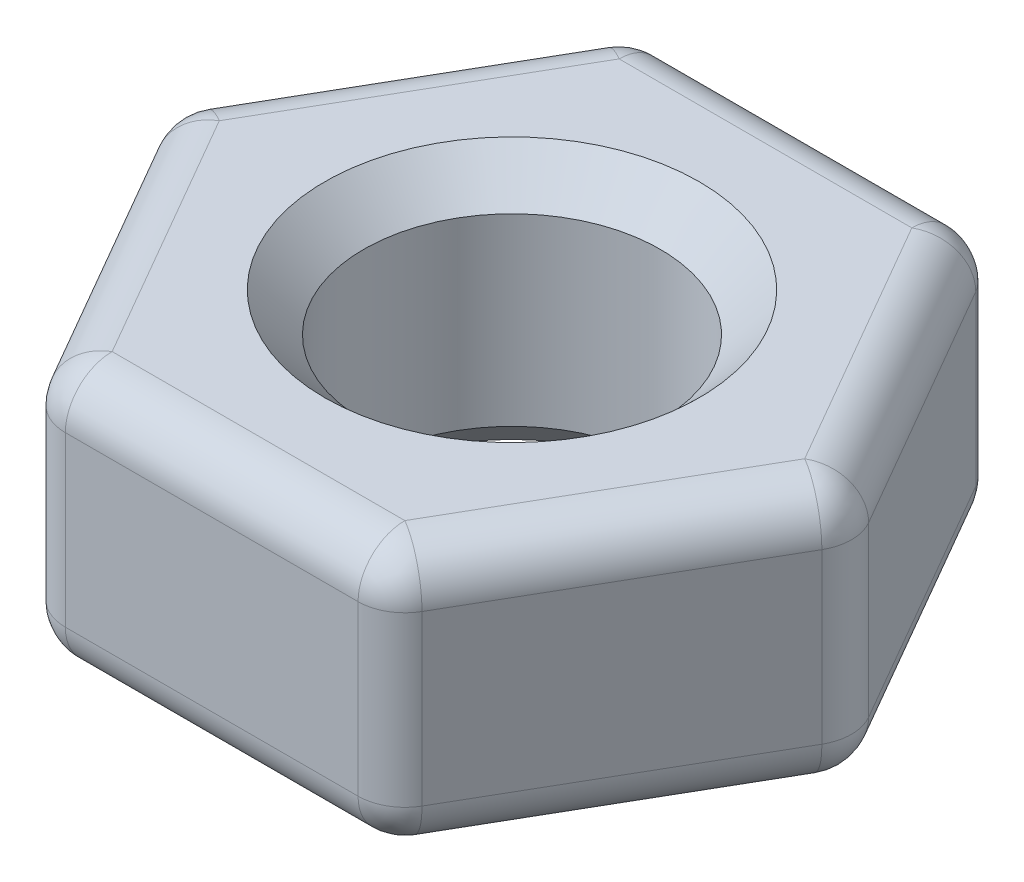
ISO-10303-21;
HEADER;
FILE_DESCRIPTION(('STEP AP214'),'2;1');
FILE_NAME('part.step','',(''),(''),'','','');
FILE_SCHEMA(('AUTOMOTIVE_DESIGN { 1 0 10303 214 1 1 1 1 }'));
ENDSEC;
DATA;
#1=APPLICATION_CONTEXT('core data for automotive mechanical design processes');
#2=APPLICATION_PROTOCOL_DEFINITION('international standard','automotive_design',2000,#1);
#3=PRODUCT_CONTEXT('',#1,'mechanical');
#4=PRODUCT('Part','Part','',(#3));
#5=PRODUCT_RELATED_PRODUCT_CATEGORY('part','',(#4));
#6=PRODUCT_DEFINITION_FORMATION('','',#4);
#7=PRODUCT_DEFINITION_CONTEXT('part definition',#1,'design');
#8=PRODUCT_DEFINITION('design','',#6,#7);
#9=PRODUCT_DEFINITION_SHAPE('','',#8);
#10=(LENGTH_UNIT() NAMED_UNIT(*) SI_UNIT(.MILLI.,.METRE.));
#11=(NAMED_UNIT(*) PLANE_ANGLE_UNIT() SI_UNIT($,.RADIAN.));
#12=(NAMED_UNIT(*) SI_UNIT($,.STERADIAN.) SOLID_ANGLE_UNIT());
#13=UNCERTAINTY_MEASURE_WITH_UNIT(LENGTH_MEASURE(1.E-05),#10,'distance_accuracy_value','');
#14=(GEOMETRIC_REPRESENTATION_CONTEXT(3) GLOBAL_UNCERTAINTY_ASSIGNED_CONTEXT((#13)) GLOBAL_UNIT_ASSIGNED_CONTEXT((#10,
#11,#12)) REPRESENTATION_CONTEXT('',''));
#15=CARTESIAN_POINT('',(0.,0.,0.));
#16=DIRECTION('',(0.,0.,1.));
#17=DIRECTION('',(1.,0.,0.));
#18=AXIS2_PLACEMENT_3D('',#15,#16,#17);
#19=CARTESIAN_POINT('',(0.,1.68,1.925));
#20=DIRECTION('',(0.,0.,-1.));
#21=DIRECTION('',(-1.,0.,0.));
#22=AXIS2_PLACEMENT_3D('',#19,#20,#21);
#23=PLANE('',#22);
#24=DIRECTION('',(1.,0.,0.));
#25=VECTOR('',#24,1.);
#26=CARTESIAN_POINT('',(-1.11139926819003,1.38,1.925));
#27=LINE('',#26,#25);
#28=CARTESIAN_POINT('',(0.938194187433143,1.38,1.925));
#29=VERTEX_POINT('',#28);
#30=CARTESIAN_POINT('',(-0.938194187433142,1.38,1.925));
#31=VERTEX_POINT('',#30);
#32=EDGE_CURVE('E177',#29,#31,#27,.F.);
#33=ORIENTED_EDGE('',*,*,#32,.T.);
#34=DIRECTION('',(0.,-1.,0.));
#35=VECTOR('',#34,1.);
#36=CARTESIAN_POINT('',(-0.938194187433142,1.68,1.925));
#37=LINE('',#36,#35);
#38=CARTESIAN_POINT('',(-0.938194187433142,0.3,1.925));
#39=VERTEX_POINT('',#38);
#40=EDGE_CURVE('E263',#31,#39,#37,.T.);
#41=ORIENTED_EDGE('',*,*,#40,.T.);
#42=DIRECTION('',(1.,0.,0.));
#43=VECTOR('',#42,1.);
#44=CARTESIAN_POINT('',(0.,0.3,1.925));
#45=LINE('',#44,#43);
#46=CARTESIAN_POINT('',(0.938194187433143,0.3,1.925));
#47=VERTEX_POINT('',#46);
#48=EDGE_CURVE('E260',#39,#47,#45,.T.);
#49=ORIENTED_EDGE('',*,*,#48,.T.);
#50=DIRECTION('',(0.,-1.,0.));
#51=VECTOR('',#50,1.);
#52=CARTESIAN_POINT('',(0.938194187433143,1.68,1.925));
#53=LINE('',#52,#51);
#54=EDGE_CURVE('E258',#47,#29,#53,.F.);
#55=ORIENTED_EDGE('',*,*,#54,.T.);
#56=EDGE_LOOP('',(#33,#41,#49,#55));
#57=FACE_BOUND('',#56,.T.);
#58=ADVANCED_FACE('F35',(#57),#23,.F.);
#59=CARTESIAN_POINT('',(1.66709890228504,1.68,0.9625));
#60=DIRECTION('',(-0.866025403784439,0.,-0.5));
#61=DIRECTION('',(-0.5,0.,0.866025403784439));
#62=AXIS2_PLACEMENT_3D('',#59,#60,#61);
#63=PLANE('',#62);
#64=DIRECTION('',(0.5,0.,-0.866025403784439));
#65=VECTOR('',#64,1.);
#66=CARTESIAN_POINT('',(1.11139926819003,1.38,1.925));
#67=LINE('',#66,#65);
#68=CARTESIAN_POINT('',(2.13619599600162,1.38,0.150000000000001));
#69=VERTEX_POINT('',#68);
#70=CARTESIAN_POINT('',(1.19800180856847,1.38,1.775));
#71=VERTEX_POINT('',#70);
#72=EDGE_CURVE('E44',#69,#71,#67,.F.);
#73=ORIENTED_EDGE('',*,*,#72,.T.);
#74=DIRECTION('',(0.,-1.,0.));
#75=VECTOR('',#74,1.);
#76=CARTESIAN_POINT('',(1.19800180856847,1.68,1.775));
#77=LINE('',#76,#75);
#78=CARTESIAN_POINT('',(1.19800180856847,0.3,1.775));
#79=VERTEX_POINT('',#78);
#80=EDGE_CURVE('E11',#71,#79,#77,.T.);
#81=ORIENTED_EDGE('',*,*,#80,.T.);
#82=DIRECTION('',(0.5,0.,-0.866025403784439));
#83=VECTOR('',#82,1.);
#84=CARTESIAN_POINT('',(1.66709890228504,0.3,0.9625));
#85=LINE('',#84,#83);
#86=CARTESIAN_POINT('',(2.13619599600162,0.3,0.150000000000001));
#87=VERTEX_POINT('',#86);
#88=EDGE_CURVE('E266',#79,#87,#85,.T.);
#89=ORIENTED_EDGE('',*,*,#88,.T.);
#90=DIRECTION('',(0.,-1.,0.));
#91=VECTOR('',#90,1.);
#92=CARTESIAN_POINT('',(2.13619599600162,1.68,0.150000000000001));
#93=LINE('',#92,#91);
#94=EDGE_CURVE('E55',#87,#69,#93,.F.);
#95=ORIENTED_EDGE('',*,*,#94,.T.);
#96=EDGE_LOOP('',(#73,#81,#89,#95));
#97=FACE_BOUND('',#96,.T.);
#98=ADVANCED_FACE('F398',(#97),#63,.F.);
#99=CARTESIAN_POINT('',(1.66709890228504,1.68,-0.9625));
#100=DIRECTION('',(-0.866025403784439,0.,0.5));
#101=DIRECTION('',(0.5,0.,0.866025403784439));
#102=AXIS2_PLACEMENT_3D('',#99,#100,#101);
#103=PLANE('',#102);
#104=DIRECTION('',(-0.5,0.,-0.866025403784439));
#105=VECTOR('',#104,1.);
#106=CARTESIAN_POINT('',(1.66709890228504,0.3,-0.9625));
#107=LINE('',#106,#105);
#108=CARTESIAN_POINT('',(2.13619599600162,0.3,-0.149999999999999));
#109=VERTEX_POINT('',#108);
#110=CARTESIAN_POINT('',(1.19800180856847,0.3,-1.775));
#111=VERTEX_POINT('',#110);
#112=EDGE_CURVE('E211',#109,#111,#107,.T.);
#113=ORIENTED_EDGE('',*,*,#112,.T.);
#114=DIRECTION('',(0.,-1.,0.));
#115=VECTOR('',#114,1.);
#116=CARTESIAN_POINT('',(1.19800180856847,1.68,-1.775));
#117=LINE('',#116,#115);
#118=CARTESIAN_POINT('',(1.19800180856847,1.38,-1.775));
#119=VERTEX_POINT('',#118);
#120=EDGE_CURVE('E216',#111,#119,#117,.F.);
#121=ORIENTED_EDGE('',*,*,#120,.T.);
#122=DIRECTION('',(-0.5,0.,-0.866025403784439));
#123=VECTOR('',#122,1.);
#124=CARTESIAN_POINT('',(2.22279853638006,1.38,0.));
#125=LINE('',#124,#123);
#126=CARTESIAN_POINT('',(2.13619599600162,1.38,-0.149999999999999));
#127=VERTEX_POINT('',#126);
#128=EDGE_CURVE('E213',#119,#127,#125,.F.);
#129=ORIENTED_EDGE('',*,*,#128,.T.);
#130=DIRECTION('',(0.,-1.,0.));
#131=VECTOR('',#130,1.);
#132=CARTESIAN_POINT('',(2.13619599600162,1.68,-0.149999999999999));
#133=LINE('',#132,#131);
#134=EDGE_CURVE('E209',#127,#109,#133,.T.);
#135=ORIENTED_EDGE('',*,*,#134,.T.);
#136=EDGE_LOOP('',(#113,#121,#129,#135));
#137=FACE_BOUND('',#136,.T.);
#138=ADVANCED_FACE('F403',(#137),#103,.F.);
#139=CARTESIAN_POINT('',(0.,1.68,-1.925));
#140=DIRECTION('',(0.,0.,1.));
#141=DIRECTION('',(1.,0.,0.));
#142=AXIS2_PLACEMENT_3D('',#139,#140,#141);
#143=PLANE('',#142);
#144=DIRECTION('',(-1.,0.,0.));
#145=VECTOR('',#144,1.);
#146=CARTESIAN_POINT('',(1.11139926819003,1.38,-1.925));
#147=LINE('',#146,#145);
#148=CARTESIAN_POINT('',(-0.938194187433142,1.38,-1.925));
#149=VERTEX_POINT('',#148);
#150=CARTESIAN_POINT('',(0.938194187433141,1.38,-1.925));
#151=VERTEX_POINT('',#150);
#152=EDGE_CURVE('E235',#149,#151,#147,.F.);
#153=ORIENTED_EDGE('',*,*,#152,.T.);
#154=DIRECTION('',(0.,-1.,0.));
#155=VECTOR('',#154,1.);
#156=CARTESIAN_POINT('',(0.938194187433141,1.68,-1.925));
#157=LINE('',#156,#155);
#158=CARTESIAN_POINT('',(0.938194187433141,0.3,-1.925));
#159=VERTEX_POINT('',#158);
#160=EDGE_CURVE('E237',#151,#159,#157,.T.);
#161=ORIENTED_EDGE('',*,*,#160,.T.);
#162=DIRECTION('',(-1.,0.,0.));
#163=VECTOR('',#162,1.);
#164=CARTESIAN_POINT('',(0.,0.3,-1.925));
#165=LINE('',#164,#163);
#166=CARTESIAN_POINT('',(-0.938194187433142,0.3,-1.925));
#167=VERTEX_POINT('',#166);
#168=EDGE_CURVE('E233',#159,#167,#165,.T.);
#169=ORIENTED_EDGE('',*,*,#168,.T.);
#170=DIRECTION('',(0.,-1.,0.));
#171=VECTOR('',#170,1.);
#172=CARTESIAN_POINT('',(-0.938194187433142,1.68,-1.925));
#173=LINE('',#172,#171);
#174=EDGE_CURVE('E231',#167,#149,#173,.F.);
#175=ORIENTED_EDGE('',*,*,#174,.T.);
#176=EDGE_LOOP('',(#153,#161,#169,#175));
#177=FACE_BOUND('',#176,.T.);
#178=ADVANCED_FACE('F393',(#177),#143,.F.);
#179=CARTESIAN_POINT('',(-1.66709890228504,1.68,-0.9625));
#180=DIRECTION('',(0.866025403784439,0.,0.5));
#181=DIRECTION('',(0.5,0.,-0.866025403784439));
#182=AXIS2_PLACEMENT_3D('',#179,#180,#181);
#183=PLANE('',#182);
#184=DIRECTION('',(-0.5,0.,0.866025403784439));
#185=VECTOR('',#184,1.);
#186=CARTESIAN_POINT('',(-1.11139926819003,1.38,-1.925));
#187=LINE('',#186,#185);
#188=CARTESIAN_POINT('',(-2.13619599600162,1.38,-0.15));
#189=VERTEX_POINT('',#188);
#190=CARTESIAN_POINT('',(-1.19800180856847,1.38,-1.775));
#191=VERTEX_POINT('',#190);
#192=EDGE_CURVE('E244',#189,#191,#187,.F.);
#193=ORIENTED_EDGE('',*,*,#192,.T.);
#194=DIRECTION('',(0.,-1.,0.));
#195=VECTOR('',#194,1.);
#196=CARTESIAN_POINT('',(-1.19800180856847,1.68,-1.775));
#197=LINE('',#196,#195);
#198=CARTESIAN_POINT('',(-1.19800180856847,0.3,-1.775));
#199=VERTEX_POINT('',#198);
#200=EDGE_CURVE('E246',#191,#199,#197,.T.);
#201=ORIENTED_EDGE('',*,*,#200,.T.);
#202=DIRECTION('',(-0.5,0.,0.866025403784439));
#203=VECTOR('',#202,1.);
#204=CARTESIAN_POINT('',(-1.66709890228504,0.3,-0.9625));
#205=LINE('',#204,#203);
#206=CARTESIAN_POINT('',(-2.13619599600162,0.3,-0.15));
#207=VERTEX_POINT('',#206);
#208=EDGE_CURVE('E242',#199,#207,#205,.T.);
#209=ORIENTED_EDGE('',*,*,#208,.T.);
#210=DIRECTION('',(0.,-1.,0.));
#211=VECTOR('',#210,1.);
#212=CARTESIAN_POINT('',(-2.13619599600162,1.68,-0.15));
#213=LINE('',#212,#211);
#214=EDGE_CURVE('E240',#207,#189,#213,.F.);
#215=ORIENTED_EDGE('',*,*,#214,.T.);
#216=EDGE_LOOP('',(#193,#201,#209,#215));
#217=FACE_BOUND('',#216,.T.);
#218=ADVANCED_FACE('F385',(#217),#183,.F.);
#219=CARTESIAN_POINT('',(0.,1.68,0.));
#220=DIRECTION('',(0.,-1.,0.));
#221=DIRECTION('',(0.,0.,-1.));
#222=AXIS2_PLACEMENT_3D('',#219,#220,#221);
#223=CYLINDRICAL_SURFACE('',#222,0.95);
#224=CARTESIAN_POINT('',(0.,1.43,0.));
#225=DIRECTION('',(0.,1.,0.));
#226=DIRECTION('',(0.,0.,1.));
#227=AXIS2_PLACEMENT_3D('',#224,#225,#226);
#228=CIRCLE('',#227,0.95);
#229=CARTESIAN_POINT('',(0.,1.43,0.95));
#230=VERTEX_POINT('',#229);
#231=EDGE_CURVE('E365',#230,#230,#228,.T.);
#232=ORIENTED_EDGE('',*,*,#231,.T.);
#233=EDGE_LOOP('',(#232));
#234=FACE_BOUND('',#233,.T.);
#235=CARTESIAN_POINT('',(0.,0.25,0.));
#236=DIRECTION('',(0.,1.,0.));
#237=DIRECTION('',(0.,0.,1.));
#238=AXIS2_PLACEMENT_3D('',#235,#236,#237);
#239=CIRCLE('',#238,0.95);
#240=CARTESIAN_POINT('',(0.,0.25,0.95));
#241=VERTEX_POINT('',#240);
#242=EDGE_CURVE('E359',#241,#241,#239,.F.);
#243=ORIENTED_EDGE('',*,*,#242,.T.);
#244=EDGE_LOOP('',(#243));
#245=FACE_BOUND('',#244,.T.);
#246=ADVANCED_FACE('F382',(#234,#245),#223,.F.);
#247=CARTESIAN_POINT('',(-1.66709890228504,1.68,0.9625));
#248=DIRECTION('',(0.866025403784439,0.,-0.5));
#249=DIRECTION('',(-0.5,0.,-0.866025403784439));
#250=AXIS2_PLACEMENT_3D('',#247,#248,#249);
#251=PLANE('',#250);
#252=DIRECTION('',(0.5,0.,0.866025403784439));
#253=VECTOR('',#252,1.);
#254=CARTESIAN_POINT('',(-2.22279853638006,1.38,0.));
#255=LINE('',#254,#253);
#256=CARTESIAN_POINT('',(-1.19800180856847,1.38,1.775));
#257=VERTEX_POINT('',#256);
#258=CARTESIAN_POINT('',(-2.13619599600162,1.38,0.15));
#259=VERTEX_POINT('',#258);
#260=EDGE_CURVE('E253',#257,#259,#255,.F.);
#261=ORIENTED_EDGE('',*,*,#260,.T.);
#262=DIRECTION('',(0.,-1.,0.));
#263=VECTOR('',#262,1.);
#264=CARTESIAN_POINT('',(-2.13619599600162,1.68,0.15));
#265=LINE('',#264,#263);
#266=CARTESIAN_POINT('',(-2.13619599600162,0.3,0.15));
#267=VERTEX_POINT('',#266);
#268=EDGE_CURVE('E255',#259,#267,#265,.T.);
#269=ORIENTED_EDGE('',*,*,#268,.T.);
#270=DIRECTION('',(0.5,0.,0.866025403784439));
#271=VECTOR('',#270,1.);
#272=CARTESIAN_POINT('',(-1.66709890228504,0.3,0.9625));
#273=LINE('',#272,#271);
#274=CARTESIAN_POINT('',(-1.19800180856847,0.3,1.775));
#275=VERTEX_POINT('',#274);
#276=EDGE_CURVE('E251',#267,#275,#273,.T.);
#277=ORIENTED_EDGE('',*,*,#276,.T.);
#278=DIRECTION('',(0.,-1.,0.));
#279=VECTOR('',#278,1.);
#280=CARTESIAN_POINT('',(-1.19800180856847,1.68,1.775));
#281=LINE('',#280,#279);
#282=EDGE_CURVE('E249',#275,#257,#281,.F.);
#283=ORIENTED_EDGE('',*,*,#282,.T.);
#284=EDGE_LOOP('',(#261,#269,#277,#283));
#285=FACE_BOUND('',#284,.T.);
#286=ADVANCED_FACE('F384',(#285),#251,.F.);
#287=CARTESIAN_POINT('',(0.,1.68,0.));
#288=DIRECTION('',(0.,1.,0.));
#289=DIRECTION('',(0.,0.,1.));
#290=AXIS2_PLACEMENT_3D('',#287,#288,#289);
#291=PLANE('',#290);
#292=DIRECTION('',(0.5,0.,-0.866025403784439));
#293=VECTOR('',#292,1.);
#294=CARTESIAN_POINT('',(1.96299091524473,1.68,-0.149999999999999));
#295=LINE('',#294,#293);
#296=CARTESIAN_POINT('',(0.938194187433143,1.68,1.625));
#297=VERTEX_POINT('',#296);
#298=CARTESIAN_POINT('',(1.87638837486628,1.68,0.));
#299=VERTEX_POINT('',#298);
#300=EDGE_CURVE('E164',#297,#299,#295,.T.);
#301=ORIENTED_EDGE('',*,*,#300,.T.);
#302=DIRECTION('',(-0.5,0.,-0.866025403784439));
#303=VECTOR('',#302,1.);
#304=CARTESIAN_POINT('',(0.851591647054697,1.68,-1.775));
#305=LINE('',#304,#303);
#306=CARTESIAN_POINT('',(0.938194187433141,1.68,-1.625));
#307=VERTEX_POINT('',#306);
#308=EDGE_CURVE('E207',#299,#307,#305,.T.);
#309=ORIENTED_EDGE('',*,*,#308,.T.);
#310=DIRECTION('',(-1.,0.,0.));
#311=VECTOR('',#310,1.);
#312=CARTESIAN_POINT('',(-1.11139926819003,1.68,-1.625));
#313=LINE('',#312,#311);
#314=CARTESIAN_POINT('',(-0.938194187433142,1.68,-1.625));
#315=VERTEX_POINT('',#314);
#316=EDGE_CURVE('E205',#307,#315,#313,.T.);
#317=ORIENTED_EDGE('',*,*,#316,.T.);
#318=DIRECTION('',(-0.5,0.,0.866025403784439));
#319=VECTOR('',#318,1.);
#320=CARTESIAN_POINT('',(-1.96299091524473,1.68,0.15));
#321=LINE('',#320,#319);
#322=CARTESIAN_POINT('',(-1.87638837486628,1.68,0.));
#323=VERTEX_POINT('',#322);
#324=EDGE_CURVE('E203',#315,#323,#321,.T.);
#325=ORIENTED_EDGE('',*,*,#324,.T.);
#326=DIRECTION('',(0.5,0.,0.866025403784439));
#327=VECTOR('',#326,1.);
#328=CARTESIAN_POINT('',(-0.851591647054698,1.68,1.775));
#329=LINE('',#328,#327);
#330=CARTESIAN_POINT('',(-0.938194187433142,1.68,1.625));
#331=VERTEX_POINT('',#330);
#332=EDGE_CURVE('E167',#323,#331,#329,.T.);
#333=ORIENTED_EDGE('',*,*,#332,.T.);
#334=DIRECTION('',(1.,0.,0.));
#335=VECTOR('',#334,1.);
#336=CARTESIAN_POINT('',(1.11139926819003,1.68,1.625));
#337=LINE('',#336,#335);
#338=EDGE_CURVE('E158',#331,#297,#337,.T.);
#339=ORIENTED_EDGE('',*,*,#338,.T.);
#340=EDGE_LOOP('',(#301,#309,#317,#325,#333,#339));
#341=FACE_BOUND('',#340,.T.);
#342=CARTESIAN_POINT('',(0.,1.68,0.));
#343=DIRECTION('',(0.,1.,0.));
#344=DIRECTION('',(0.,0.,1.));
#345=AXIS2_PLACEMENT_3D('',#342,#343,#344);
#346=CIRCLE('',#345,1.2);
#347=CARTESIAN_POINT('',(0.,1.68,1.2));
#348=VERTEX_POINT('',#347);
#349=EDGE_CURVE('E198',#348,#348,#346,.F.);
#350=ORIENTED_EDGE('',*,*,#349,.T.);
#351=EDGE_LOOP('',(#350));
#352=FACE_BOUND('',#351,.T.);
#353=ADVANCED_FACE('F160',(#341,#352),#291,.T.);
#354=CARTESIAN_POINT('',(0.,0.,0.));
#355=DIRECTION('',(0.,1.,0.));
#356=DIRECTION('',(0.,0.,1.));
#357=AXIS2_PLACEMENT_3D('',#354,#355,#356);
#358=PLANE('',#357);
#359=DIRECTION('',(-1.,0.,0.));
#360=VECTOR('',#359,1.);
#361=CARTESIAN_POINT('',(0.,0.,-1.625));
#362=LINE('',#361,#360);
#363=CARTESIAN_POINT('',(-0.938194187433142,0.,-1.625));
#364=VERTEX_POINT('',#363);
#365=CARTESIAN_POINT('',(0.938194187433141,0.,-1.625));
#366=VERTEX_POINT('',#365);
#367=EDGE_CURVE('E226',#364,#366,#362,.F.);
#368=ORIENTED_EDGE('',*,*,#367,.T.);
#369=DIRECTION('',(-0.5,0.,-0.866025403784439));
#370=VECTOR('',#369,1.);
#371=CARTESIAN_POINT('',(1.40729128114971,0.,-0.8125));
#372=LINE('',#371,#370);
#373=CARTESIAN_POINT('',(1.87638837486628,0.,0.));
#374=VERTEX_POINT('',#373);
#375=EDGE_CURVE('E228',#366,#374,#372,.F.);
#376=ORIENTED_EDGE('',*,*,#375,.T.);
#377=DIRECTION('',(0.5,0.,-0.866025403784439));
#378=VECTOR('',#377,1.);
#379=CARTESIAN_POINT('',(1.40729128114971,0.,0.812500000000001));
#380=LINE('',#379,#378);
#381=CARTESIAN_POINT('',(0.938194187433143,0.,1.625));
#382=VERTEX_POINT('',#381);
#383=EDGE_CURVE('E218',#374,#382,#380,.F.);
#384=ORIENTED_EDGE('',*,*,#383,.T.);
#385=DIRECTION('',(1.,0.,0.));
#386=VECTOR('',#385,1.);
#387=CARTESIAN_POINT('',(0.,0.,1.625));
#388=LINE('',#387,#386);
#389=CARTESIAN_POINT('',(-0.938194187433142,0.,1.625));
#390=VERTEX_POINT('',#389);
#391=EDGE_CURVE('E220',#382,#390,#388,.F.);
#392=ORIENTED_EDGE('',*,*,#391,.T.);
#393=DIRECTION('',(0.5,0.,0.866025403784439));
#394=VECTOR('',#393,1.);
#395=CARTESIAN_POINT('',(-1.40729128114971,0.,0.8125));
#396=LINE('',#395,#394);
#397=CARTESIAN_POINT('',(-1.87638837486628,0.,0.));
#398=VERTEX_POINT('',#397);
#399=EDGE_CURVE('E222',#390,#398,#396,.F.);
#400=ORIENTED_EDGE('',*,*,#399,.T.);
#401=DIRECTION('',(-0.5,0.,0.866025403784439));
#402=VECTOR('',#401,1.);
#403=CARTESIAN_POINT('',(-1.40729128114971,0.,-0.8125));
#404=LINE('',#403,#402);
#405=EDGE_CURVE('E224',#398,#364,#404,.F.);
#406=ORIENTED_EDGE('',*,*,#405,.T.);
#407=EDGE_LOOP('',(#368,#376,#384,#392,#400,#406));
#408=FACE_BOUND('',#407,.T.);
#409=CARTESIAN_POINT('',(0.,0.,0.));
#410=DIRECTION('',(0.,1.,0.));
#411=DIRECTION('',(0.,0.,1.));
#412=AXIS2_PLACEMENT_3D('',#409,#410,#411);
#413=CIRCLE('',#412,1.2);
#414=CARTESIAN_POINT('',(0.,0.,1.2));
#415=VERTEX_POINT('',#414);
#416=EDGE_CURVE('E195',#415,#415,#413,.T.);
#417=ORIENTED_EDGE('',*,*,#416,.T.);
#418=EDGE_LOOP('',(#417));
#419=FACE_BOUND('',#418,.T.);
#420=ADVANCED_FACE('F378',(#408,#419),#358,.F.);
#421=CARTESIAN_POINT('',(0.,1.43,0.));
#422=DIRECTION('',(0.,1.,0.));
#423=DIRECTION('',(0.,0.,1.));
#424=AXIS2_PLACEMENT_3D('',#421,#422,#423);
#425=CONICAL_SURFACE('',#424,0.95,0.78539816339745);
#426=ORIENTED_EDGE('',*,*,#349,.F.);
#427=EDGE_LOOP('',(#426));
#428=FACE_BOUND('',#427,.T.);
#429=ORIENTED_EDGE('',*,*,#231,.F.);
#430=EDGE_LOOP('',(#429));
#431=FACE_BOUND('',#430,.T.);
#432=ADVANCED_FACE('F374',(#428,#431),#425,.F.);
#433=CARTESIAN_POINT('',(0.,0.,0.));
#434=DIRECTION('',(0.,-1.,0.));
#435=DIRECTION('',(0.,0.,-1.));
#436=AXIS2_PLACEMENT_3D('',#433,#434,#435);
#437=CONICAL_SURFACE('',#436,1.2,0.785398163397448);
#438=ORIENTED_EDGE('',*,*,#242,.F.);
#439=EDGE_LOOP('',(#438));
#440=FACE_BOUND('',#439,.T.);
#441=ORIENTED_EDGE('',*,*,#416,.F.);
#442=EDGE_LOOP('',(#441));
#443=FACE_BOUND('',#442,.T.);
#444=ADVANCED_FACE('F377',(#440,#443),#437,.F.);
#445=CARTESIAN_POINT('',(-1.40729128114971,0.3,0.8125));
#446=DIRECTION('',(0.5,0.,0.866025403784439));
#447=DIRECTION('',(0.866025403784439,0.,-0.5));
#448=AXIS2_PLACEMENT_3D('',#445,#446,#447);
#449=CYLINDRICAL_SURFACE('',#448,0.3);
#450=CARTESIAN_POINT('',(-0.938194187433142,0.3,1.625));
#451=DIRECTION('',(0.5,0.,0.866025403784439));
#452=DIRECTION('',(0.866025403784439,0.,-0.5));
#453=AXIS2_PLACEMENT_3D('',#450,#451,#452);
#454=CIRCLE('',#453,0.3);
#455=EDGE_CURVE('E39',#275,#390,#454,.T.);
#456=ORIENTED_EDGE('',*,*,#455,.F.);
#457=ORIENTED_EDGE('',*,*,#276,.F.);
#458=CARTESIAN_POINT('',(-1.87638837486628,0.3,0.));
#459=DIRECTION('',(-0.5,0.,-0.866025403784439));
#460=DIRECTION('',(-0.866025403784439,0.,0.5));
#461=AXIS2_PLACEMENT_3D('',#458,#459,#460);
#462=CIRCLE('',#461,0.3);
#463=EDGE_CURVE('E351',#398,#267,#462,.T.);
#464=ORIENTED_EDGE('',*,*,#463,.F.);
#465=ORIENTED_EDGE('',*,*,#399,.F.);
#466=EDGE_LOOP('',(#456,#457,#464,#465));
#467=FACE_BOUND('',#466,.T.);
#468=ADVANCED_FACE('F37',(#467),#449,.T.);
#469=CARTESIAN_POINT('',(-0.938194187433142,0.3,1.625));
#470=DIRECTION('',(0.,0.,1.));
#471=DIRECTION('',(1.,0.,0.));
#472=AXIS2_PLACEMENT_3D('',#469,#470,#471);
#473=SPHERICAL_SURFACE('',#472,0.3);
#474=CARTESIAN_POINT('',(-0.938194187433142,0.3,1.625));
#475=DIRECTION('',(0.,-1.,0.));
#476=DIRECTION('',(0.,0.,-1.));
#477=AXIS2_PLACEMENT_3D('',#474,#475,#476);
#478=CIRCLE('',#477,0.3);
#479=EDGE_CURVE('E346',#275,#39,#478,.F.);
#480=ORIENTED_EDGE('',*,*,#479,.F.);
#481=ORIENTED_EDGE('',*,*,#455,.T.);
#482=CARTESIAN_POINT('',(-0.938194187433142,0.3,1.625));
#483=DIRECTION('',(-1.,0.,0.));
#484=DIRECTION('',(0.,0.,1.));
#485=AXIS2_PLACEMENT_3D('',#482,#483,#484);
#486=CIRCLE('',#485,0.3);
#487=EDGE_CURVE('E349',#39,#390,#486,.F.);
#488=ORIENTED_EDGE('',*,*,#487,.F.);
#489=EDGE_LOOP('',(#480,#481,#488));
#490=FACE_BOUND('',#489,.T.);
#491=ADVANCED_FACE('F441',(#490),#473,.T.);
#492=CARTESIAN_POINT('',(-1.87638837486628,0.3,0.));
#493=DIRECTION('',(0.,0.,1.));
#494=DIRECTION('',(1.,0.,0.));
#495=AXIS2_PLACEMENT_3D('',#492,#493,#494);
#496=SPHERICAL_SURFACE('',#495,0.3);
#497=CARTESIAN_POINT('',(-1.87638837486628,0.3,0.));
#498=DIRECTION('',(-0.5,0.,0.866025403784439));
#499=DIRECTION('',(0.866025403784439,0.,0.5));
#500=AXIS2_PLACEMENT_3D('',#497,#498,#499);
#501=CIRCLE('',#500,0.3);
#502=EDGE_CURVE('E341',#398,#207,#501,.F.);
#503=ORIENTED_EDGE('',*,*,#502,.F.);
#504=ORIENTED_EDGE('',*,*,#463,.T.);
#505=CARTESIAN_POINT('',(-1.87638837486628,0.3,0.));
#506=DIRECTION('',(0.,-1.,0.));
#507=DIRECTION('',(0.,0.,-1.));
#508=AXIS2_PLACEMENT_3D('',#505,#506,#507);
#509=CIRCLE('',#508,0.3);
#510=EDGE_CURVE('E344',#207,#267,#509,.F.);
#511=ORIENTED_EDGE('',*,*,#510,.F.);
#512=EDGE_LOOP('',(#503,#504,#511));
#513=FACE_BOUND('',#512,.T.);
#514=ADVANCED_FACE('F448',(#513),#496,.T.);
#515=CARTESIAN_POINT('',(0.,0.3,1.625));
#516=DIRECTION('',(1.,0.,0.));
#517=DIRECTION('',(0.,0.,-1.));
#518=AXIS2_PLACEMENT_3D('',#515,#516,#517);
#519=CYLINDRICAL_SURFACE('',#518,0.3);
#520=ORIENTED_EDGE('',*,*,#487,.T.);
#521=ORIENTED_EDGE('',*,*,#391,.F.);
#522=CARTESIAN_POINT('',(0.938194187433143,0.3,1.625));
#523=DIRECTION('',(1.,0.,0.));
#524=DIRECTION('',(0.,0.,-1.));
#525=AXIS2_PLACEMENT_3D('',#522,#523,#524);
#526=CIRCLE('',#525,0.3);
#527=EDGE_CURVE('E338',#47,#382,#526,.T.);
#528=ORIENTED_EDGE('',*,*,#527,.F.);
#529=ORIENTED_EDGE('',*,*,#48,.F.);
#530=EDGE_LOOP('',(#520,#521,#528,#529));
#531=FACE_BOUND('',#530,.T.);
#532=ADVANCED_FACE('F454',(#531),#519,.T.);
#533=CARTESIAN_POINT('',(-0.938194187433142,1.68,1.625));
#534=DIRECTION('',(0.,-1.,0.));
#535=DIRECTION('',(0.,0.,-1.));
#536=AXIS2_PLACEMENT_3D('',#533,#534,#535);
#537=CYLINDRICAL_SURFACE('',#536,0.3);
#538=ORIENTED_EDGE('',*,*,#479,.T.);
#539=ORIENTED_EDGE('',*,*,#40,.F.);
#540=CARTESIAN_POINT('',(-0.938194187433142,1.38,1.625));
#541=DIRECTION('',(0.,1.,0.));
#542=DIRECTION('',(0.,0.,1.));
#543=AXIS2_PLACEMENT_3D('',#540,#541,#542);
#544=CIRCLE('',#543,0.3);
#545=EDGE_CURVE('E335',#257,#31,#544,.T.);
#546=ORIENTED_EDGE('',*,*,#545,.F.);
#547=ORIENTED_EDGE('',*,*,#282,.F.);
#548=EDGE_LOOP('',(#538,#539,#546,#547));
#549=FACE_BOUND('',#548,.T.);
#550=ADVANCED_FACE('F461',(#549),#537,.T.);
#551=CARTESIAN_POINT('',(-1.40729128114971,1.38,0.8125));
#552=DIRECTION('',(-0.5,0.,-0.866025403784439));
#553=DIRECTION('',(-0.866025403784439,0.,0.5));
#554=AXIS2_PLACEMENT_3D('',#551,#552,#553);
#555=CYLINDRICAL_SURFACE('',#554,0.3);
#556=CARTESIAN_POINT('',(-1.87638837486628,1.38,0.));
#557=DIRECTION('',(-0.5,0.,-0.866025403784439));
#558=DIRECTION('',(-0.866025403784439,0.,0.5));
#559=AXIS2_PLACEMENT_3D('',#556,#557,#558);
#560=CIRCLE('',#559,0.3);
#561=EDGE_CURVE('E329',#259,#323,#560,.T.);
#562=ORIENTED_EDGE('',*,*,#561,.F.);
#563=ORIENTED_EDGE('',*,*,#260,.F.);
#564=CARTESIAN_POINT('',(-0.938194187433142,1.38,1.625));
#565=DIRECTION('',(0.499999999999999,0.,0.866025403784439));
#566=DIRECTION('',(0.866025403784439,0.,-0.499999999999999));
#567=AXIS2_PLACEMENT_3D('',#564,#565,#566);
#568=CIRCLE('',#567,0.3);
#569=EDGE_CURVE('E332',#331,#257,#568,.T.);
#570=ORIENTED_EDGE('',*,*,#569,.F.);
#571=ORIENTED_EDGE('',*,*,#332,.F.);
#572=EDGE_LOOP('',(#562,#563,#570,#571));
#573=FACE_BOUND('',#572,.T.);
#574=ADVANCED_FACE('F469',(#573),#555,.T.);
#575=CARTESIAN_POINT('',(-1.87638837486628,1.68,0.));
#576=DIRECTION('',(0.,-1.,0.));
#577=DIRECTION('',(0.,0.,-1.));
#578=AXIS2_PLACEMENT_3D('',#575,#576,#577);
#579=CYLINDRICAL_SURFACE('',#578,0.3);
#580=ORIENTED_EDGE('',*,*,#510,.T.);
#581=ORIENTED_EDGE('',*,*,#268,.F.);
#582=CARTESIAN_POINT('',(-1.87638837486628,1.38,0.));
#583=DIRECTION('',(0.,1.,0.));
#584=DIRECTION('',(0.,0.,1.));
#585=AXIS2_PLACEMENT_3D('',#582,#583,#584);
#586=CIRCLE('',#585,0.3);
#587=EDGE_CURVE('E326',#189,#259,#586,.T.);
#588=ORIENTED_EDGE('',*,*,#587,.F.);
#589=ORIENTED_EDGE('',*,*,#214,.F.);
#590=EDGE_LOOP('',(#580,#581,#588,#589));
#591=FACE_BOUND('',#590,.T.);
#592=ADVANCED_FACE('F477',(#591),#579,.T.);
#593=CARTESIAN_POINT('',(-1.40729128114971,0.3,-0.8125));
#594=DIRECTION('',(-0.5,0.,0.866025403784439));
#595=DIRECTION('',(0.866025403784439,0.,0.5));
#596=AXIS2_PLACEMENT_3D('',#593,#594,#595);
#597=CYLINDRICAL_SURFACE('',#596,0.3);
#598=ORIENTED_EDGE('',*,*,#502,.T.);
#599=ORIENTED_EDGE('',*,*,#208,.F.);
#600=CARTESIAN_POINT('',(-0.938194187433142,0.3,-1.625));
#601=DIRECTION('',(0.5,0.,-0.866025403784439));
#602=DIRECTION('',(-0.866025403784439,0.,-0.5));
#603=AXIS2_PLACEMENT_3D('',#600,#601,#602);
#604=CIRCLE('',#603,0.3);
#605=EDGE_CURVE('E323',#364,#199,#604,.T.);
#606=ORIENTED_EDGE('',*,*,#605,.F.);
#607=ORIENTED_EDGE('',*,*,#405,.F.);
#608=EDGE_LOOP('',(#598,#599,#606,#607));
#609=FACE_BOUND('',#608,.T.);
#610=ADVANCED_FACE('F485',(#609),#597,.T.);
#611=CARTESIAN_POINT('',(0.938194187433143,0.3,1.625));
#612=DIRECTION('',(0.,0.,1.));
#613=DIRECTION('',(1.,0.,0.));
#614=AXIS2_PLACEMENT_3D('',#611,#612,#613);
#615=SPHERICAL_SURFACE('',#614,0.3);
#616=CARTESIAN_POINT('',(0.938194187433143,0.3,1.625));
#617=DIRECTION('',(0.,-1.,0.));
#618=DIRECTION('',(0.,0.,-1.));
#619=AXIS2_PLACEMENT_3D('',#616,#617,#618);
#620=CIRCLE('',#619,0.3);
#621=EDGE_CURVE('E317',#47,#79,#620,.F.);
#622=ORIENTED_EDGE('',*,*,#621,.F.);
#623=ORIENTED_EDGE('',*,*,#527,.T.);
#624=CARTESIAN_POINT('',(0.938194187433143,0.3,1.625));
#625=DIRECTION('',(-0.500000000000001,0.,0.866025403784438));
#626=DIRECTION('',(0.866025403784438,0.,0.500000000000001));
#627=AXIS2_PLACEMENT_3D('',#624,#625,#626);
#628=CIRCLE('',#627,0.3);
#629=EDGE_CURVE('E320',#79,#382,#628,.F.);
#630=ORIENTED_EDGE('',*,*,#629,.F.);
#631=EDGE_LOOP('',(#622,#623,#630));
#632=FACE_BOUND('',#631,.T.);
#633=ADVANCED_FACE('F493',(#632),#615,.T.);
#634=CARTESIAN_POINT('',(-0.938194187433142,1.38,1.625));
#635=DIRECTION('',(0.,0.,1.));
#636=DIRECTION('',(1.,0.,0.));
#637=AXIS2_PLACEMENT_3D('',#634,#635,#636);
#638=SPHERICAL_SURFACE('',#637,0.3);
#639=ORIENTED_EDGE('',*,*,#569,.T.);
#640=ORIENTED_EDGE('',*,*,#545,.T.);
#641=CARTESIAN_POINT('',(-0.938194187433142,1.38,1.625));
#642=DIRECTION('',(-1.,0.,0.));
#643=DIRECTION('',(0.,-1.,0.));
#644=AXIS2_PLACEMENT_3D('',#641,#642,#643);
#645=CIRCLE('',#644,0.3);
#646=EDGE_CURVE('E315',#331,#31,#645,.F.);
#647=ORIENTED_EDGE('',*,*,#646,.F.);
#648=EDGE_LOOP('',(#639,#640,#647));
#649=FACE_BOUND('',#648,.T.);
#650=ADVANCED_FACE('F501',(#649),#638,.T.);
#651=CARTESIAN_POINT('',(-1.87638837486628,1.38,0.));
#652=DIRECTION('',(0.,0.,1.));
#653=DIRECTION('',(1.,0.,0.));
#654=AXIS2_PLACEMENT_3D('',#651,#652,#653);
#655=SPHERICAL_SURFACE('',#654,0.3);
#656=ORIENTED_EDGE('',*,*,#587,.T.);
#657=ORIENTED_EDGE('',*,*,#561,.T.);
#658=CARTESIAN_POINT('',(-1.87638837486628,1.38,0.));
#659=DIRECTION('',(-0.5,0.,0.866025403784439));
#660=DIRECTION('',(0.866025403784439,0.,0.5));
#661=AXIS2_PLACEMENT_3D('',#658,#659,#660);
#662=CIRCLE('',#661,0.3);
#663=EDGE_CURVE('E312',#189,#323,#662,.F.);
#664=ORIENTED_EDGE('',*,*,#663,.F.);
#665=EDGE_LOOP('',(#656,#657,#664));
#666=FACE_BOUND('',#665,.T.);
#667=ADVANCED_FACE('F509',(#666),#655,.T.);
#668=CARTESIAN_POINT('',(-0.938194187433142,0.3,-1.625));
#669=DIRECTION('',(0.,0.,1.));
#670=DIRECTION('',(1.,0.,0.));
#671=AXIS2_PLACEMENT_3D('',#668,#669,#670);
#672=SPHERICAL_SURFACE('',#671,0.3);
#673=CARTESIAN_POINT('',(-0.938194187433142,0.3,-1.625));
#674=DIRECTION('',(-1.,0.,0.));
#675=DIRECTION('',(0.,-1.,0.));
#676=AXIS2_PLACEMENT_3D('',#673,#674,#675);
#677=CIRCLE('',#676,0.3);
#678=EDGE_CURVE('E307',#364,#167,#677,.F.);
#679=ORIENTED_EDGE('',*,*,#678,.F.);
#680=ORIENTED_EDGE('',*,*,#605,.T.);
#681=CARTESIAN_POINT('',(-0.938194187433142,0.3,-1.625));
#682=DIRECTION('',(0.,-1.,0.));
#683=DIRECTION('',(0.,0.,-1.));
#684=AXIS2_PLACEMENT_3D('',#681,#682,#683);
#685=CIRCLE('',#684,0.3);
#686=EDGE_CURVE('E310',#167,#199,#685,.F.);
#687=ORIENTED_EDGE('',*,*,#686,.F.);
#688=EDGE_LOOP('',(#679,#680,#687));
#689=FACE_BOUND('',#688,.T.);
#690=ADVANCED_FACE('F517',(#689),#672,.T.);
#691=CARTESIAN_POINT('',(1.40729128114971,0.3,0.8125));
#692=DIRECTION('',(0.5,0.,-0.866025403784439));
#693=DIRECTION('',(-0.866025403784439,0.,-0.5));
#694=AXIS2_PLACEMENT_3D('',#691,#692,#693);
#695=CYLINDRICAL_SURFACE('',#694,0.3);
#696=ORIENTED_EDGE('',*,*,#629,.T.);
#697=ORIENTED_EDGE('',*,*,#383,.F.);
#698=CARTESIAN_POINT('',(1.87638837486628,0.3,0.));
#699=DIRECTION('',(0.5,0.,-0.866025403784439));
#700=DIRECTION('',(-0.866025403784439,0.,-0.5));
#701=AXIS2_PLACEMENT_3D('',#698,#699,#700);
#702=CIRCLE('',#701,0.3);
#703=EDGE_CURVE('E302',#87,#374,#702,.T.);
#704=ORIENTED_EDGE('',*,*,#703,.F.);
#705=ORIENTED_EDGE('',*,*,#88,.F.);
#706=EDGE_LOOP('',(#696,#697,#704,#705));
#707=FACE_BOUND('',#706,.T.);
#708=ADVANCED_FACE('F525',(#707),#695,.T.);
#709=CARTESIAN_POINT('',(0.938194187433143,1.68,1.625));
#710=DIRECTION('',(0.,-1.,0.));
#711=DIRECTION('',(0.,0.,-1.));
#712=AXIS2_PLACEMENT_3D('',#709,#710,#711);
#713=CYLINDRICAL_SURFACE('',#712,0.3);
#714=ORIENTED_EDGE('',*,*,#621,.T.);
#715=ORIENTED_EDGE('',*,*,#80,.F.);
#716=CARTESIAN_POINT('',(0.938194187433143,1.38,1.625));
#717=DIRECTION('',(0.,1.,0.));
#718=DIRECTION('',(0.,0.,1.));
#719=AXIS2_PLACEMENT_3D('',#716,#717,#718);
#720=CIRCLE('',#719,0.3);
#721=EDGE_CURVE('E181',#29,#71,#720,.T.);
#722=ORIENTED_EDGE('',*,*,#721,.F.);
#723=ORIENTED_EDGE('',*,*,#54,.F.);
#724=EDGE_LOOP('',(#714,#715,#722,#723));
#725=FACE_BOUND('',#724,.T.);
#726=ADVANCED_FACE('F533',(#725),#713,.T.);
#727=CARTESIAN_POINT('',(0.,1.38,1.625));
#728=DIRECTION('',(-1.,0.,0.));
#729=DIRECTION('',(0.,0.,1.));
#730=AXIS2_PLACEMENT_3D('',#727,#728,#729);
#731=CYLINDRICAL_SURFACE('',#730,0.3);
#732=ORIENTED_EDGE('',*,*,#646,.T.);
#733=ORIENTED_EDGE('',*,*,#32,.F.);
#734=CARTESIAN_POINT('',(0.938194187433143,1.38,1.625));
#735=DIRECTION('',(1.,0.,0.));
#736=DIRECTION('',(0.,0.,-1.));
#737=AXIS2_PLACEMENT_3D('',#734,#735,#736);
#738=CIRCLE('',#737,0.3);
#739=EDGE_CURVE('E174',#297,#29,#738,.T.);
#740=ORIENTED_EDGE('',*,*,#739,.F.);
#741=ORIENTED_EDGE('',*,*,#338,.F.);
#742=EDGE_LOOP('',(#732,#733,#740,#741));
#743=FACE_BOUND('',#742,.T.);
#744=ADVANCED_FACE('F176',(#743),#731,.T.);
#745=CARTESIAN_POINT('',(-1.40729128114971,1.38,-0.8125));
#746=DIRECTION('',(0.5,0.,-0.866025403784439));
#747=DIRECTION('',(-0.866025403784439,0.,-0.5));
#748=AXIS2_PLACEMENT_3D('',#745,#746,#747);
#749=CYLINDRICAL_SURFACE('',#748,0.3);
#750=ORIENTED_EDGE('',*,*,#663,.T.);
#751=ORIENTED_EDGE('',*,*,#324,.F.);
#752=CARTESIAN_POINT('',(-0.938194187433142,1.38,-1.625));
#753=DIRECTION('',(0.5,0.,-0.866025403784439));
#754=DIRECTION('',(-0.866025403784439,0.,-0.5));
#755=AXIS2_PLACEMENT_3D('',#752,#753,#754);
#756=CIRCLE('',#755,0.3);
#757=EDGE_CURVE('E182',#191,#315,#756,.T.);
#758=ORIENTED_EDGE('',*,*,#757,.F.);
#759=ORIENTED_EDGE('',*,*,#192,.F.);
#760=EDGE_LOOP('',(#750,#751,#758,#759));
#761=FACE_BOUND('',#760,.T.);
#762=ADVANCED_FACE('F548',(#761),#749,.T.);
#763=CARTESIAN_POINT('',(-0.938194187433142,1.68,-1.625));
#764=DIRECTION('',(0.,-1.,0.));
#765=DIRECTION('',(0.,0.,-1.));
#766=AXIS2_PLACEMENT_3D('',#763,#764,#765);
#767=CYLINDRICAL_SURFACE('',#766,0.3);
#768=ORIENTED_EDGE('',*,*,#686,.T.);
#769=ORIENTED_EDGE('',*,*,#200,.F.);
#770=CARTESIAN_POINT('',(-0.938194187433142,1.38,-1.625));
#771=DIRECTION('',(0.,1.,0.));
#772=DIRECTION('',(0.,0.,1.));
#773=AXIS2_PLACEMENT_3D('',#770,#771,#772);
#774=CIRCLE('',#773,0.3);
#775=EDGE_CURVE('E296',#149,#191,#774,.T.);
#776=ORIENTED_EDGE('',*,*,#775,.F.);
#777=ORIENTED_EDGE('',*,*,#174,.F.);
#778=EDGE_LOOP('',(#768,#769,#776,#777));
#779=FACE_BOUND('',#778,.T.);
#780=ADVANCED_FACE('F555',(#779),#767,.T.);
#781=CARTESIAN_POINT('',(0.,0.3,-1.625));
#782=DIRECTION('',(-1.,0.,0.));
#783=DIRECTION('',(0.,0.,1.));
#784=AXIS2_PLACEMENT_3D('',#781,#782,#783);
#785=CYLINDRICAL_SURFACE('',#784,0.3);
#786=ORIENTED_EDGE('',*,*,#678,.T.);
#787=ORIENTED_EDGE('',*,*,#168,.F.);
#788=CARTESIAN_POINT('',(0.938194187433141,0.3,-1.625));
#789=DIRECTION('',(1.,0.,0.));
#790=DIRECTION('',(0.,0.,-1.));
#791=AXIS2_PLACEMENT_3D('',#788,#789,#790);
#792=CIRCLE('',#791,0.3);
#793=EDGE_CURVE('E293',#366,#159,#792,.T.);
#794=ORIENTED_EDGE('',*,*,#793,.F.);
#795=ORIENTED_EDGE('',*,*,#367,.F.);
#796=EDGE_LOOP('',(#786,#787,#794,#795));
#797=FACE_BOUND('',#796,.T.);
#798=ADVANCED_FACE('F563',(#797),#785,.T.);
#799=CARTESIAN_POINT('',(1.40729128114971,0.3,-0.8125));
#800=DIRECTION('',(-0.5,0.,-0.866025403784439));
#801=DIRECTION('',(-0.866025403784439,0.,0.5));
#802=AXIS2_PLACEMENT_3D('',#799,#800,#801);
#803=CYLINDRICAL_SURFACE('',#802,0.3);
#804=CARTESIAN_POINT('',(1.87638837486628,0.3,0.));
#805=DIRECTION('',(0.5,0.,0.866025403784439));
#806=DIRECTION('',(0.866025403784439,0.,-0.5));
#807=AXIS2_PLACEMENT_3D('',#804,#805,#806);
#808=CIRCLE('',#807,0.3);
#809=EDGE_CURVE('E304',#374,#109,#808,.T.);
#810=ORIENTED_EDGE('',*,*,#809,.F.);
#811=ORIENTED_EDGE('',*,*,#375,.F.);
#812=CARTESIAN_POINT('',(0.938194187433141,0.3,-1.625));
#813=DIRECTION('',(-0.5,0.,-0.866025403784439));
#814=DIRECTION('',(-0.866025403784439,0.,0.5));
#815=AXIS2_PLACEMENT_3D('',#812,#813,#814);
#816=CIRCLE('',#815,0.3);
#817=EDGE_CURVE('E290',#111,#366,#816,.T.);
#818=ORIENTED_EDGE('',*,*,#817,.F.);
#819=ORIENTED_EDGE('',*,*,#112,.F.);
#820=EDGE_LOOP('',(#810,#811,#818,#819));
#821=FACE_BOUND('',#820,.T.);
#822=ADVANCED_FACE('F571',(#821),#803,.T.);
#823=CARTESIAN_POINT('',(1.87638837486628,0.3,0.));
#824=DIRECTION('',(0.,0.,1.));
#825=DIRECTION('',(1.,0.,0.));
#826=AXIS2_PLACEMENT_3D('',#823,#824,#825);
#827=SPHERICAL_SURFACE('',#826,0.3);
#828=ORIENTED_EDGE('',*,*,#703,.T.);
#829=ORIENTED_EDGE('',*,*,#809,.T.);
#830=CARTESIAN_POINT('',(1.87638837486628,0.3,0.));
#831=DIRECTION('',(0.,-1.,0.));
#832=DIRECTION('',(0.,0.,-1.));
#833=AXIS2_PLACEMENT_3D('',#830,#831,#832);
#834=CIRCLE('',#833,0.3);
#835=EDGE_CURVE('E188',#87,#109,#834,.F.);
#836=ORIENTED_EDGE('',*,*,#835,.F.);
#837=EDGE_LOOP('',(#828,#829,#836));
#838=FACE_BOUND('',#837,.T.);
#839=ADVANCED_FACE('F579',(#838),#827,.T.);
#840=CARTESIAN_POINT('',(0.938194187433143,1.38,1.625));
#841=DIRECTION('',(0.,0.,1.));
#842=DIRECTION('',(1.,0.,0.));
#843=AXIS2_PLACEMENT_3D('',#840,#841,#842);
#844=SPHERICAL_SURFACE('',#843,0.3);
#845=ORIENTED_EDGE('',*,*,#739,.T.);
#846=ORIENTED_EDGE('',*,*,#721,.T.);
#847=CARTESIAN_POINT('',(0.938194187433143,1.38,1.625));
#848=DIRECTION('',(-0.5,0.,0.866025403784439));
#849=DIRECTION('',(0.866025403784439,0.,0.5));
#850=AXIS2_PLACEMENT_3D('',#847,#848,#849);
#851=CIRCLE('',#850,0.3);
#852=EDGE_CURVE('E185',#297,#71,#851,.F.);
#853=ORIENTED_EDGE('',*,*,#852,.F.);
#854=EDGE_LOOP('',(#845,#846,#853));
#855=FACE_BOUND('',#854,.T.);
#856=ADVANCED_FACE('F186',(#855),#844,.T.);
#857=CARTESIAN_POINT('',(-0.938194187433142,1.38,-1.625));
#858=DIRECTION('',(0.,0.,1.));
#859=DIRECTION('',(1.,0.,0.));
#860=AXIS2_PLACEMENT_3D('',#857,#858,#859);
#861=SPHERICAL_SURFACE('',#860,0.3);
#862=ORIENTED_EDGE('',*,*,#775,.T.);
#863=ORIENTED_EDGE('',*,*,#757,.T.);
#864=CARTESIAN_POINT('',(-0.938194187433142,1.38,-1.625));
#865=DIRECTION('',(-1.,0.,0.));
#866=DIRECTION('',(0.,0.,1.));
#867=AXIS2_PLACEMENT_3D('',#864,#865,#866);
#868=CIRCLE('',#867,0.3);
#869=EDGE_CURVE('E189',#149,#315,#868,.F.);
#870=ORIENTED_EDGE('',*,*,#869,.F.);
#871=EDGE_LOOP('',(#862,#863,#870));
#872=FACE_BOUND('',#871,.T.);
#873=ADVANCED_FACE('F594',(#872),#861,.T.);
#874=CARTESIAN_POINT('',(0.938194187433141,0.3,-1.625));
#875=DIRECTION('',(0.,0.,1.));
#876=DIRECTION('',(1.,0.,0.));
#877=AXIS2_PLACEMENT_3D('',#874,#875,#876);
#878=SPHERICAL_SURFACE('',#877,0.3);
#879=ORIENTED_EDGE('',*,*,#817,.T.);
#880=ORIENTED_EDGE('',*,*,#793,.T.);
#881=CARTESIAN_POINT('',(0.938194187433141,0.3,-1.625));
#882=DIRECTION('',(0.,-1.,0.));
#883=DIRECTION('',(0.,0.,-1.));
#884=AXIS2_PLACEMENT_3D('',#881,#882,#883);
#885=CIRCLE('',#884,0.3);
#886=EDGE_CURVE('E284',#111,#159,#885,.F.);
#887=ORIENTED_EDGE('',*,*,#886,.F.);
#888=EDGE_LOOP('',(#879,#880,#887));
#889=FACE_BOUND('',#888,.T.);
#890=ADVANCED_FACE('F601',(#889),#878,.T.);
#891=CARTESIAN_POINT('',(1.87638837486628,1.68,0.));
#892=DIRECTION('',(0.,-1.,0.));
#893=DIRECTION('',(0.,0.,-1.));
#894=AXIS2_PLACEMENT_3D('',#891,#892,#893);
#895=CYLINDRICAL_SURFACE('',#894,0.3);
#896=ORIENTED_EDGE('',*,*,#835,.T.);
#897=ORIENTED_EDGE('',*,*,#134,.F.);
#898=CARTESIAN_POINT('',(1.87638837486628,1.38,0.));
#899=DIRECTION('',(0.,1.,0.));
#900=DIRECTION('',(0.,0.,1.));
#901=AXIS2_PLACEMENT_3D('',#898,#899,#900);
#902=CIRCLE('',#901,0.3);
#903=EDGE_CURVE('E281',#69,#127,#902,.T.);
#904=ORIENTED_EDGE('',*,*,#903,.F.);
#905=ORIENTED_EDGE('',*,*,#94,.F.);
#906=EDGE_LOOP('',(#896,#897,#904,#905));
#907=FACE_BOUND('',#906,.T.);
#908=ADVANCED_FACE('F609',(#907),#895,.T.);
#909=CARTESIAN_POINT('',(1.40729128114971,1.38,0.8125));
#910=DIRECTION('',(-0.5,0.,0.866025403784439));
#911=DIRECTION('',(0.866025403784439,0.,0.5));
#912=AXIS2_PLACEMENT_3D('',#909,#910,#911);
#913=CYLINDRICAL_SURFACE('',#912,0.3);
#914=ORIENTED_EDGE('',*,*,#852,.T.);
#915=ORIENTED_EDGE('',*,*,#72,.F.);
#916=CARTESIAN_POINT('',(1.87638837486628,1.38,0.));
#917=DIRECTION('',(0.500000000000001,0.,-0.866025403784438));
#918=DIRECTION('',(-0.866025403784438,0.,-0.500000000000001));
#919=AXIS2_PLACEMENT_3D('',#916,#917,#918);
#920=CIRCLE('',#919,0.3);
#921=EDGE_CURVE('E193',#299,#69,#920,.T.);
#922=ORIENTED_EDGE('',*,*,#921,.F.);
#923=ORIENTED_EDGE('',*,*,#300,.F.);
#924=EDGE_LOOP('',(#914,#915,#922,#923));
#925=FACE_BOUND('',#924,.T.);
#926=ADVANCED_FACE('F191',(#925),#913,.T.);
#927=CARTESIAN_POINT('',(0.,1.38,-1.625));
#928=DIRECTION('',(1.,0.,0.));
#929=DIRECTION('',(0.,0.,-1.));
#930=AXIS2_PLACEMENT_3D('',#927,#928,#929);
#931=CYLINDRICAL_SURFACE('',#930,0.3);
#932=ORIENTED_EDGE('',*,*,#869,.T.);
#933=ORIENTED_EDGE('',*,*,#316,.F.);
#934=CARTESIAN_POINT('',(0.938194187433141,1.38,-1.625));
#935=DIRECTION('',(1.,0.,0.));
#936=DIRECTION('',(0.,1.,0.));
#937=AXIS2_PLACEMENT_3D('',#934,#935,#936);
#938=CIRCLE('',#937,0.3);
#939=EDGE_CURVE('E277',#151,#307,#938,.T.);
#940=ORIENTED_EDGE('',*,*,#939,.F.);
#941=ORIENTED_EDGE('',*,*,#152,.F.);
#942=EDGE_LOOP('',(#932,#933,#940,#941));
#943=FACE_BOUND('',#942,.T.);
#944=ADVANCED_FACE('F624',(#943),#931,.T.);
#945=CARTESIAN_POINT('',(0.938194187433141,1.68,-1.625));
#946=DIRECTION('',(0.,-1.,0.));
#947=DIRECTION('',(0.,0.,-1.));
#948=AXIS2_PLACEMENT_3D('',#945,#946,#947);
#949=CYLINDRICAL_SURFACE('',#948,0.3);
#950=ORIENTED_EDGE('',*,*,#886,.T.);
#951=ORIENTED_EDGE('',*,*,#160,.F.);
#952=CARTESIAN_POINT('',(0.938194187433141,1.38,-1.625));
#953=DIRECTION('',(0.,1.,0.));
#954=DIRECTION('',(0.,0.,1.));
#955=AXIS2_PLACEMENT_3D('',#952,#953,#954);
#956=CIRCLE('',#955,0.3);
#957=EDGE_CURVE('E274',#119,#151,#956,.T.);
#958=ORIENTED_EDGE('',*,*,#957,.F.);
#959=ORIENTED_EDGE('',*,*,#120,.F.);
#960=EDGE_LOOP('',(#950,#951,#958,#959));
#961=FACE_BOUND('',#960,.T.);
#962=ADVANCED_FACE('F631',(#961),#949,.T.);
#963=CARTESIAN_POINT('',(1.87638837486628,1.38,0.));
#964=DIRECTION('',(0.,0.,1.));
#965=DIRECTION('',(1.,0.,0.));
#966=AXIS2_PLACEMENT_3D('',#963,#964,#965);
#967=SPHERICAL_SURFACE('',#966,0.3);
#968=ORIENTED_EDGE('',*,*,#921,.T.);
#969=ORIENTED_EDGE('',*,*,#903,.T.);
#970=CARTESIAN_POINT('',(1.87638837486628,1.38,0.));
#971=DIRECTION('',(0.5,0.,0.866025403784438));
#972=DIRECTION('',(0.866025403784438,0.,-0.5));
#973=AXIS2_PLACEMENT_3D('',#970,#971,#972);
#974=CIRCLE('',#973,0.3);
#975=EDGE_CURVE('E272',#299,#127,#974,.F.);
#976=ORIENTED_EDGE('',*,*,#975,.F.);
#977=EDGE_LOOP('',(#968,#969,#976));
#978=FACE_BOUND('',#977,.T.);
#979=ADVANCED_FACE('F639',(#978),#967,.T.);
#980=CARTESIAN_POINT('',(0.938194187433141,1.38,-1.625));
#981=DIRECTION('',(0.,0.,1.));
#982=DIRECTION('',(1.,0.,0.));
#983=AXIS2_PLACEMENT_3D('',#980,#981,#982);
#984=SPHERICAL_SURFACE('',#983,0.3);
#985=ORIENTED_EDGE('',*,*,#957,.T.);
#986=ORIENTED_EDGE('',*,*,#939,.T.);
#987=CARTESIAN_POINT('',(0.938194187433141,1.38,-1.625));
#988=DIRECTION('',(-0.500000000000001,0.,-0.866025403784438));
#989=DIRECTION('',(-0.866025403784438,0.,0.500000000000001));
#990=AXIS2_PLACEMENT_3D('',#987,#988,#989);
#991=CIRCLE('',#990,0.3);
#992=EDGE_CURVE('E270',#119,#307,#991,.F.);
#993=ORIENTED_EDGE('',*,*,#992,.F.);
#994=EDGE_LOOP('',(#985,#986,#993));
#995=FACE_BOUND('',#994,.T.);
#996=ADVANCED_FACE('F647',(#995),#984,.T.);
#997=CARTESIAN_POINT('',(1.40729128114971,1.38,-0.8125));
#998=DIRECTION('',(0.5,0.,0.866025403784439));
#999=DIRECTION('',(0.866025403784439,0.,-0.5));
#1000=AXIS2_PLACEMENT_3D('',#997,#998,#999);
#1001=CYLINDRICAL_SURFACE('',#1000,0.3);
#1002=ORIENTED_EDGE('',*,*,#975,.T.);
#1003=ORIENTED_EDGE('',*,*,#128,.F.);
#1004=ORIENTED_EDGE('',*,*,#992,.T.);
#1005=ORIENTED_EDGE('',*,*,#308,.F.);
#1006=EDGE_LOOP('',(#1002,#1003,#1004,#1005));
#1007=FACE_BOUND('',#1006,.T.);
#1008=ADVANCED_FACE('F655',(#1007),#1001,.T.);
#1009=CLOSED_SHELL('',(#58,#98,#138,#178,#218,#246,#286,#353,#420,#432,#444,#468,#491,#514,#532,
#550,#574,#592,#610,#633,#650,#667,#690,#708,#726,#744,#762,#780,#798,#822,#839,#856,#873,#890,
#908,#926,#944,#962,#979,#996,#1008));
#1010=MANIFOLD_SOLID_BREP('B2',#1009);
#1011=ADVANCED_BREP_SHAPE_REPRESENTATION('',(#18,#1010),#14);
#1012=SHAPE_DEFINITION_REPRESENTATION(#9,#1011);
ENDSEC;
END-ISO-10303-21;
